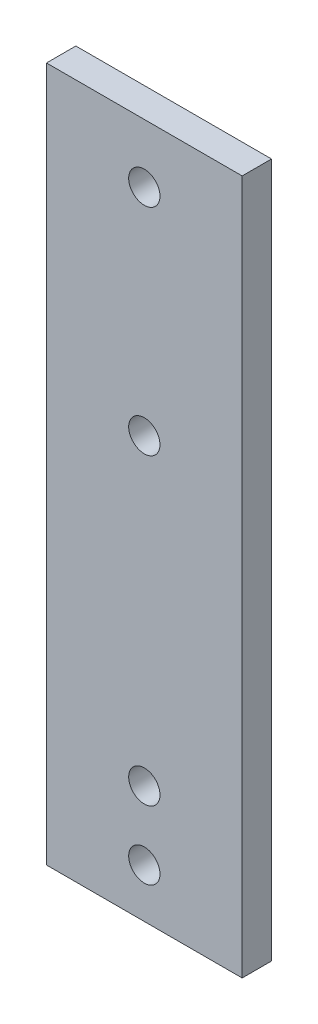
ISO-10303-21;
HEADER;
FILE_DESCRIPTION(('STEP AP214'),'2;1');
FILE_NAME('part.step','',(''),(''),'','','');
FILE_SCHEMA(('AUTOMOTIVE_DESIGN { 1 0 10303 214 1 1 1 1 }'));
ENDSEC;
DATA;
#1=APPLICATION_CONTEXT('core data for automotive mechanical design processes');
#2=APPLICATION_PROTOCOL_DEFINITION('international standard','automotive_design',2000,#1);
#3=PRODUCT_CONTEXT('',#1,'mechanical');
#4=PRODUCT('Part','Part','',(#3));
#5=PRODUCT_RELATED_PRODUCT_CATEGORY('part','',(#4));
#6=PRODUCT_DEFINITION_FORMATION('','',#4);
#7=PRODUCT_DEFINITION_CONTEXT('part definition',#1,'design');
#8=PRODUCT_DEFINITION('design','',#6,#7);
#9=PRODUCT_DEFINITION_SHAPE('','',#8);
#10=(LENGTH_UNIT() NAMED_UNIT(*) SI_UNIT(.MILLI.,.METRE.));
#11=(NAMED_UNIT(*) PLANE_ANGLE_UNIT() SI_UNIT($,.RADIAN.));
#12=(NAMED_UNIT(*) SI_UNIT($,.STERADIAN.) SOLID_ANGLE_UNIT());
#13=UNCERTAINTY_MEASURE_WITH_UNIT(LENGTH_MEASURE(1.E-05),#10,'distance_accuracy_value','');
#14=(GEOMETRIC_REPRESENTATION_CONTEXT(3) GLOBAL_UNCERTAINTY_ASSIGNED_CONTEXT((#13)) GLOBAL_UNIT_ASSIGNED_CONTEXT((#10,
#11,#12)) REPRESENTATION_CONTEXT('',''));
#15=CARTESIAN_POINT('',(0.,0.,0.));
#16=DIRECTION('',(0.,0.,1.));
#17=DIRECTION('',(1.,0.,0.));
#18=AXIS2_PLACEMENT_3D('',#15,#16,#17);
#19=CARTESIAN_POINT('',(0.,0.,3.));
#20=DIRECTION('',(0.,0.,-1.));
#21=DIRECTION('',(-1.,0.,0.));
#22=AXIS2_PLACEMENT_3D('',#19,#20,#21);
#23=PLANE('',#22);
#24=DIRECTION('',(1.,0.,0.));
#25=VECTOR('',#24,1.);
#26=CARTESIAN_POINT('',(20.,0.,3.));
#27=LINE('',#26,#25);
#28=CARTESIAN_POINT('',(0.,0.,3.));
#29=VERTEX_POINT('',#28);
#30=CARTESIAN_POINT('',(20.,0.,3.));
#31=VERTEX_POINT('',#30);
#32=EDGE_CURVE('E88',#29,#31,#27,.T.);
#33=ORIENTED_EDGE('',*,*,#32,.T.);
#34=DIRECTION('',(0.,1.,0.));
#35=VECTOR('',#34,1.);
#36=CARTESIAN_POINT('',(20.,35.4736639446398,3.));
#37=LINE('',#36,#35);
#38=CARTESIAN_POINT('',(20.,71.,3.));
#39=VERTEX_POINT('',#38);
#40=EDGE_CURVE('E82',#31,#39,#37,.T.);
#41=ORIENTED_EDGE('',*,*,#40,.T.);
#42=DIRECTION('',(-1.,0.,0.));
#43=VECTOR('',#42,1.);
#44=CARTESIAN_POINT('',(0.,71.,3.));
#45=LINE('',#44,#43);
#46=CARTESIAN_POINT('',(0.,71.,3.));
#47=VERTEX_POINT('',#46);
#48=EDGE_CURVE('E85',#39,#47,#45,.T.);
#49=ORIENTED_EDGE('',*,*,#48,.T.);
#50=DIRECTION('',(0.,-1.,0.));
#51=VECTOR('',#50,1.);
#52=CARTESIAN_POINT('',(0.,35.,3.));
#53=LINE('',#52,#51);
#54=EDGE_CURVE('E54',#47,#29,#53,.T.);
#55=ORIENTED_EDGE('',*,*,#54,.T.);
#56=EDGE_LOOP('',(#33,#41,#49,#55));
#57=FACE_BOUND('',#56,.T.);
#58=CARTESIAN_POINT('',(10.,65.,3.));
#59=DIRECTION('',(0.,0.,1.));
#60=DIRECTION('',(1.,0.,0.));
#61=AXIS2_PLACEMENT_3D('',#58,#59,#60);
#62=CIRCLE('',#61,1.60000000000001);
#63=CARTESIAN_POINT('',(11.6,65.,3.));
#64=VERTEX_POINT('',#63);
#65=EDGE_CURVE('E105',#64,#64,#62,.T.);
#66=ORIENTED_EDGE('',*,*,#65,.F.);
#67=EDGE_LOOP('',(#66));
#68=FACE_BOUND('',#67,.T.);
#69=CARTESIAN_POINT('',(10.,43.,3.));
#70=DIRECTION('',(0.,0.,1.));
#71=DIRECTION('',(1.,0.,0.));
#72=AXIS2_PLACEMENT_3D('',#69,#70,#71);
#73=CIRCLE('',#72,1.6);
#74=CARTESIAN_POINT('',(11.6,43.,3.));
#75=VERTEX_POINT('',#74);
#76=EDGE_CURVE('E117',#75,#75,#73,.T.);
#77=ORIENTED_EDGE('',*,*,#76,.F.);
#78=EDGE_LOOP('',(#77));
#79=FACE_BOUND('',#78,.T.);
#80=CARTESIAN_POINT('',(10.,12.,3.));
#81=DIRECTION('',(0.,0.,1.));
#82=DIRECTION('',(1.,0.,0.));
#83=AXIS2_PLACEMENT_3D('',#80,#81,#82);
#84=CIRCLE('',#83,1.6);
#85=CARTESIAN_POINT('',(11.6,12.,3.));
#86=VERTEX_POINT('',#85);
#87=EDGE_CURVE('E123',#86,#86,#84,.T.);
#88=ORIENTED_EDGE('',*,*,#87,.F.);
#89=EDGE_LOOP('',(#88));
#90=FACE_BOUND('',#89,.T.);
#91=CARTESIAN_POINT('',(10.,5.,3.));
#92=DIRECTION('',(0.,0.,1.));
#93=DIRECTION('',(1.,0.,0.));
#94=AXIS2_PLACEMENT_3D('',#91,#92,#93);
#95=CIRCLE('',#94,1.6);
#96=CARTESIAN_POINT('',(11.6,5.,3.));
#97=VERTEX_POINT('',#96);
#98=EDGE_CURVE('E129',#97,#97,#95,.T.);
#99=ORIENTED_EDGE('',*,*,#98,.F.);
#100=EDGE_LOOP('',(#99));
#101=FACE_BOUND('',#100,.T.);
#102=ADVANCED_FACE('F37',(#57,#68,#79,#90,#101),#23,.F.);
#103=CARTESIAN_POINT('',(0.,0.,0.));
#104=DIRECTION('',(0.,0.,-1.));
#105=DIRECTION('',(-1.,0.,0.));
#106=AXIS2_PLACEMENT_3D('',#103,#104,#105);
#107=PLANE('',#106);
#108=CARTESIAN_POINT('',(10.,12.,0.));
#109=DIRECTION('',(0.,0.,1.));
#110=DIRECTION('',(1.,0.,0.));
#111=AXIS2_PLACEMENT_3D('',#108,#109,#110);
#112=CIRCLE('',#111,1.6);
#113=CARTESIAN_POINT('',(11.6,12.,0.));
#114=VERTEX_POINT('',#113);
#115=EDGE_CURVE('E126',#114,#114,#112,.T.);
#116=ORIENTED_EDGE('',*,*,#115,.T.);
#117=EDGE_LOOP('',(#116));
#118=FACE_BOUND('',#117,.T.);
#119=CARTESIAN_POINT('',(10.,65.,0.));
#120=DIRECTION('',(0.,0.,1.));
#121=DIRECTION('',(1.,0.,0.));
#122=AXIS2_PLACEMENT_3D('',#119,#120,#121);
#123=CIRCLE('',#122,1.60000000000001);
#124=CARTESIAN_POINT('',(11.6,65.,0.));
#125=VERTEX_POINT('',#124);
#126=EDGE_CURVE('E114',#125,#125,#123,.T.);
#127=ORIENTED_EDGE('',*,*,#126,.T.);
#128=EDGE_LOOP('',(#127));
#129=FACE_BOUND('',#128,.T.);
#130=DIRECTION('',(1.,0.,0.));
#131=VECTOR('',#130,1.);
#132=CARTESIAN_POINT('',(20.,0.,0.));
#133=LINE('',#132,#131);
#134=CARTESIAN_POINT('',(0.,0.,0.));
#135=VERTEX_POINT('',#134);
#136=CARTESIAN_POINT('',(20.,0.,0.));
#137=VERTEX_POINT('',#136);
#138=EDGE_CURVE('E102',#135,#137,#133,.T.);
#139=ORIENTED_EDGE('',*,*,#138,.F.);
#140=DIRECTION('',(0.,-1.,0.));
#141=VECTOR('',#140,1.);
#142=CARTESIAN_POINT('',(0.,0.,0.));
#143=LINE('',#142,#141);
#144=CARTESIAN_POINT('',(0.,71.,0.));
#145=VERTEX_POINT('',#144);
#146=EDGE_CURVE('E71',#145,#135,#143,.T.);
#147=ORIENTED_EDGE('',*,*,#146,.F.);
#148=DIRECTION('',(-1.,0.,0.));
#149=VECTOR('',#148,1.);
#150=CARTESIAN_POINT('',(0.,71.,0.));
#151=LINE('',#150,#149);
#152=CARTESIAN_POINT('',(20.,71.,0.));
#153=VERTEX_POINT('',#152);
#154=EDGE_CURVE('E107',#153,#145,#151,.T.);
#155=ORIENTED_EDGE('',*,*,#154,.F.);
#156=DIRECTION('',(0.,1.,0.));
#157=VECTOR('',#156,1.);
#158=CARTESIAN_POINT('',(20.,71.,0.));
#159=LINE('',#158,#157);
#160=EDGE_CURVE('E93',#137,#153,#159,.T.);
#161=ORIENTED_EDGE('',*,*,#160,.F.);
#162=EDGE_LOOP('',(#139,#147,#155,#161));
#163=FACE_BOUND('',#162,.T.);
#164=CARTESIAN_POINT('',(10.,43.,0.));
#165=DIRECTION('',(0.,0.,1.));
#166=DIRECTION('',(1.,0.,0.));
#167=AXIS2_PLACEMENT_3D('',#164,#165,#166);
#168=CIRCLE('',#167,1.6);
#169=CARTESIAN_POINT('',(11.6,43.,0.));
#170=VERTEX_POINT('',#169);
#171=EDGE_CURVE('E120',#170,#170,#168,.T.);
#172=ORIENTED_EDGE('',*,*,#171,.T.);
#173=EDGE_LOOP('',(#172));
#174=FACE_BOUND('',#173,.T.);
#175=CARTESIAN_POINT('',(10.,5.,0.));
#176=DIRECTION('',(0.,0.,1.));
#177=DIRECTION('',(1.,0.,0.));
#178=AXIS2_PLACEMENT_3D('',#175,#176,#177);
#179=CIRCLE('',#178,1.6);
#180=CARTESIAN_POINT('',(11.6,5.,0.));
#181=VERTEX_POINT('',#180);
#182=EDGE_CURVE('E132',#181,#181,#179,.T.);
#183=ORIENTED_EDGE('',*,*,#182,.T.);
#184=EDGE_LOOP('',(#183));
#185=FACE_BOUND('',#184,.T.);
#186=ADVANCED_FACE('F142',(#118,#129,#163,#174,#185),#107,.T.);
#187=CARTESIAN_POINT('',(20.,0.,3.));
#188=DIRECTION('',(0.,1.,0.));
#189=DIRECTION('',(-1.,0.,0.));
#190=AXIS2_PLACEMENT_3D('',#187,#188,#189);
#191=PLANE('',#190);
#192=ORIENTED_EDGE('',*,*,#138,.T.);
#193=DIRECTION('',(0.,0.,-1.));
#194=VECTOR('',#193,1.);
#195=CARTESIAN_POINT('',(20.,0.,3.));
#196=LINE('',#195,#194);
#197=EDGE_CURVE('E11',#31,#137,#196,.T.);
#198=ORIENTED_EDGE('',*,*,#197,.F.);
#199=ORIENTED_EDGE('',*,*,#32,.F.);
#200=DIRECTION('',(0.,0.,-1.));
#201=VECTOR('',#200,1.);
#202=CARTESIAN_POINT('',(0.,0.,3.));
#203=LINE('',#202,#201);
#204=EDGE_CURVE('E98',#29,#135,#203,.T.);
#205=ORIENTED_EDGE('',*,*,#204,.T.);
#206=EDGE_LOOP('',(#192,#198,#199,#205));
#207=FACE_BOUND('',#206,.T.);
#208=ADVANCED_FACE('F39',(#207),#191,.F.);
#209=CARTESIAN_POINT('',(20.,71.,3.));
#210=DIRECTION('',(-1.,0.,0.));
#211=DIRECTION('',(0.,0.,1.));
#212=AXIS2_PLACEMENT_3D('',#209,#210,#211);
#213=PLANE('',#212);
#214=ORIENTED_EDGE('',*,*,#160,.T.);
#215=DIRECTION('',(0.,0.,-1.));
#216=VECTOR('',#215,1.);
#217=CARTESIAN_POINT('',(20.,71.,3.));
#218=LINE('',#217,#216);
#219=EDGE_CURVE('E46',#39,#153,#218,.T.);
#220=ORIENTED_EDGE('',*,*,#219,.F.);
#221=ORIENTED_EDGE('',*,*,#40,.F.);
#222=ORIENTED_EDGE('',*,*,#197,.T.);
#223=EDGE_LOOP('',(#214,#220,#221,#222));
#224=FACE_BOUND('',#223,.T.);
#225=ADVANCED_FACE('F92',(#224),#213,.F.);
#226=CARTESIAN_POINT('',(0.,71.,3.));
#227=DIRECTION('',(0.,-1.,0.));
#228=DIRECTION('',(1.,0.,0.));
#229=AXIS2_PLACEMENT_3D('',#226,#227,#228);
#230=PLANE('',#229);
#231=ORIENTED_EDGE('',*,*,#154,.T.);
#232=DIRECTION('',(0.,0.,-1.));
#233=VECTOR('',#232,1.);
#234=CARTESIAN_POINT('',(0.,71.,3.));
#235=LINE('',#234,#233);
#236=EDGE_CURVE('E95',#47,#145,#235,.T.);
#237=ORIENTED_EDGE('',*,*,#236,.F.);
#238=ORIENTED_EDGE('',*,*,#48,.F.);
#239=ORIENTED_EDGE('',*,*,#219,.T.);
#240=EDGE_LOOP('',(#231,#237,#238,#239));
#241=FACE_BOUND('',#240,.T.);
#242=ADVANCED_FACE('F96',(#241),#230,.F.);
#243=CARTESIAN_POINT('',(0.,0.,3.));
#244=DIRECTION('',(1.,0.,0.));
#245=DIRECTION('',(0.,0.,-1.));
#246=AXIS2_PLACEMENT_3D('',#243,#244,#245);
#247=PLANE('',#246);
#248=ORIENTED_EDGE('',*,*,#146,.T.);
#249=ORIENTED_EDGE('',*,*,#204,.F.);
#250=ORIENTED_EDGE('',*,*,#54,.F.);
#251=ORIENTED_EDGE('',*,*,#236,.T.);
#252=EDGE_LOOP('',(#248,#249,#250,#251));
#253=FACE_BOUND('',#252,.T.);
#254=ADVANCED_FACE('F111',(#253),#247,.F.);
#255=CARTESIAN_POINT('',(10.,65.,3.));
#256=DIRECTION('',(0.,0.,-1.));
#257=DIRECTION('',(-1.,0.,0.));
#258=AXIS2_PLACEMENT_3D('',#255,#256,#257);
#259=CYLINDRICAL_SURFACE('',#258,1.60000000000001);
#260=ORIENTED_EDGE('',*,*,#65,.T.);
#261=EDGE_LOOP('',(#260));
#262=FACE_BOUND('',#261,.T.);
#263=ORIENTED_EDGE('',*,*,#126,.F.);
#264=EDGE_LOOP('',(#263));
#265=FACE_BOUND('',#264,.T.);
#266=ADVANCED_FACE('F150',(#262,#265),#259,.F.);
#267=CARTESIAN_POINT('',(10.,43.,3.));
#268=DIRECTION('',(0.,0.,-1.));
#269=DIRECTION('',(-1.,0.,0.));
#270=AXIS2_PLACEMENT_3D('',#267,#268,#269);
#271=CYLINDRICAL_SURFACE('',#270,1.6);
#272=ORIENTED_EDGE('',*,*,#76,.T.);
#273=EDGE_LOOP('',(#272));
#274=FACE_BOUND('',#273,.T.);
#275=ORIENTED_EDGE('',*,*,#171,.F.);
#276=EDGE_LOOP('',(#275));
#277=FACE_BOUND('',#276,.T.);
#278=ADVANCED_FACE('F202',(#274,#277),#271,.F.);
#279=CARTESIAN_POINT('',(10.,12.,3.));
#280=DIRECTION('',(0.,0.,-1.));
#281=DIRECTION('',(-1.,0.,0.));
#282=AXIS2_PLACEMENT_3D('',#279,#280,#281);
#283=CYLINDRICAL_SURFACE('',#282,1.6);
#284=ORIENTED_EDGE('',*,*,#87,.T.);
#285=EDGE_LOOP('',(#284));
#286=FACE_BOUND('',#285,.T.);
#287=ORIENTED_EDGE('',*,*,#115,.F.);
#288=EDGE_LOOP('',(#287));
#289=FACE_BOUND('',#288,.T.);
#290=ADVANCED_FACE('F210',(#286,#289),#283,.F.);
#291=CARTESIAN_POINT('',(10.,5.,3.));
#292=DIRECTION('',(0.,0.,-1.));
#293=DIRECTION('',(-1.,0.,0.));
#294=AXIS2_PLACEMENT_3D('',#291,#292,#293);
#295=CYLINDRICAL_SURFACE('',#294,1.6);
#296=ORIENTED_EDGE('',*,*,#98,.T.);
#297=EDGE_LOOP('',(#296));
#298=FACE_BOUND('',#297,.T.);
#299=ORIENTED_EDGE('',*,*,#182,.F.);
#300=EDGE_LOOP('',(#299));
#301=FACE_BOUND('',#300,.T.);
#302=ADVANCED_FACE('F138',(#298,#301),#295,.F.);
#303=CLOSED_SHELL('',(#102,#186,#208,#225,#242,#254,#266,#278,#290,#302));
#304=MANIFOLD_SOLID_BREP('B2',#303);
#305=ADVANCED_BREP_SHAPE_REPRESENTATION('',(#18,#304),#14);
#306=SHAPE_DEFINITION_REPRESENTATION(#9,#305);
ENDSEC;
END-ISO-10303-21;
